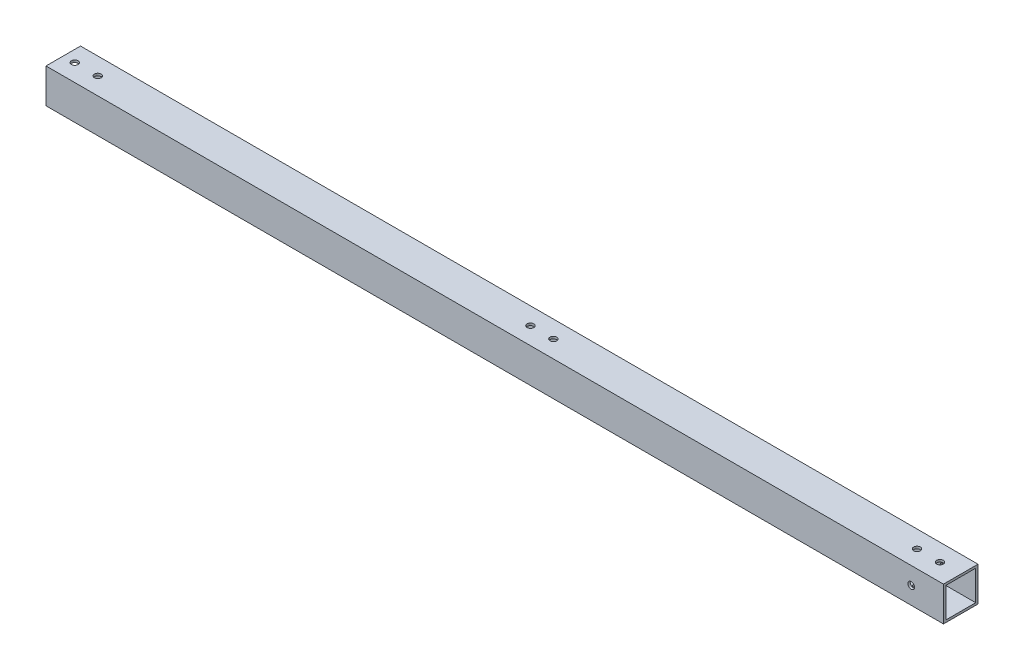
ISO-10303-21;
HEADER;
FILE_DESCRIPTION(('STEP AP214'),'2;1');
FILE_NAME('part.step','',(''),(''),'','','');
FILE_SCHEMA(('AUTOMOTIVE_DESIGN { 1 0 10303 214 1 1 1 1 }'));
ENDSEC;
DATA;
#1=APPLICATION_CONTEXT('core data for automotive mechanical design processes');
#2=APPLICATION_PROTOCOL_DEFINITION('international standard','automotive_design',2000,#1);
#3=PRODUCT_CONTEXT('',#1,'mechanical');
#4=PRODUCT('Part','Part','',(#3));
#5=PRODUCT_RELATED_PRODUCT_CATEGORY('part','',(#4));
#6=PRODUCT_DEFINITION_FORMATION('','',#4);
#7=PRODUCT_DEFINITION_CONTEXT('part definition',#1,'design');
#8=PRODUCT_DEFINITION('design','',#6,#7);
#9=PRODUCT_DEFINITION_SHAPE('','',#8);
#10=(LENGTH_UNIT() NAMED_UNIT(*) SI_UNIT(.MILLI.,.METRE.));
#11=(NAMED_UNIT(*) PLANE_ANGLE_UNIT() SI_UNIT($,.RADIAN.));
#12=(NAMED_UNIT(*) SI_UNIT($,.STERADIAN.) SOLID_ANGLE_UNIT());
#13=UNCERTAINTY_MEASURE_WITH_UNIT(LENGTH_MEASURE(1.E-05),#10,'distance_accuracy_value','');
#14=(GEOMETRIC_REPRESENTATION_CONTEXT(3) GLOBAL_UNCERTAINTY_ASSIGNED_CONTEXT((#13)) GLOBAL_UNIT_ASSIGNED_CONTEXT((#10,
#11,#12)) REPRESENTATION_CONTEXT('',''));
#15=CARTESIAN_POINT('',(0.,0.,0.));
#16=DIRECTION('',(0.,0.,1.));
#17=DIRECTION('',(1.,0.,0.));
#18=AXIS2_PLACEMENT_3D('',#15,#16,#17);
#19=CARTESIAN_POINT('',(390.,0.,0.));
#20=DIRECTION('',(-1.,0.,0.));
#21=DIRECTION('',(0.,0.,1.));
#22=AXIS2_PLACEMENT_3D('',#19,#20,#21);
#23=PLANE('',#22);
#24=DIRECTION('',(0.,1.,0.));
#25=VECTOR('',#24,1.);
#26=CARTESIAN_POINT('',(390.,-7.5,-7.5));
#27=LINE('',#26,#25);
#28=CARTESIAN_POINT('',(390.,-7.5,-7.5));
#29=VERTEX_POINT('',#28);
#30=CARTESIAN_POINT('',(390.,7.5,-7.5));
#31=VERTEX_POINT('',#30);
#32=EDGE_CURVE('E146',#29,#31,#27,.T.);
#33=ORIENTED_EDGE('',*,*,#32,.T.);
#34=DIRECTION('',(0.,0.,1.));
#35=VECTOR('',#34,1.);
#36=CARTESIAN_POINT('',(390.,7.5,7.5));
#37=LINE('',#36,#35);
#38=CARTESIAN_POINT('',(390.,7.5,7.5));
#39=VERTEX_POINT('',#38);
#40=EDGE_CURVE('E149',#31,#39,#37,.T.);
#41=ORIENTED_EDGE('',*,*,#40,.T.);
#42=DIRECTION('',(0.,-1.,0.));
#43=VECTOR('',#42,1.);
#44=CARTESIAN_POINT('',(390.,-7.5,7.5));
#45=LINE('',#44,#43);
#46=CARTESIAN_POINT('',(390.,-7.5,7.5));
#47=VERTEX_POINT('',#46);
#48=EDGE_CURVE('E152',#39,#47,#45,.T.);
#49=ORIENTED_EDGE('',*,*,#48,.T.);
#50=DIRECTION('',(0.,0.,-1.));
#51=VECTOR('',#50,1.);
#52=CARTESIAN_POINT('',(390.,-7.5,7.5));
#53=LINE('',#52,#51);
#54=EDGE_CURVE('E154',#47,#29,#53,.T.);
#55=ORIENTED_EDGE('',*,*,#54,.T.);
#56=EDGE_LOOP('',(#33,#41,#49,#55));
#57=FACE_BOUND('',#56,.T.);
#58=DIRECTION('',(0.,0.,-1.));
#59=VECTOR('',#58,1.);
#60=CARTESIAN_POINT('',(390.,-6.5,6.5));
#61=LINE('',#60,#59);
#62=CARTESIAN_POINT('',(390.,-6.5,6.5));
#63=VERTEX_POINT('',#62);
#64=CARTESIAN_POINT('',(390.,-6.5,-6.5));
#65=VERTEX_POINT('',#64);
#66=EDGE_CURVE('E108',#63,#65,#61,.T.);
#67=ORIENTED_EDGE('',*,*,#66,.F.);
#68=DIRECTION('',(0.,-1.,0.));
#69=VECTOR('',#68,1.);
#70=CARTESIAN_POINT('',(390.,-6.5,6.5));
#71=LINE('',#70,#69);
#72=CARTESIAN_POINT('',(390.,6.5,6.5));
#73=VERTEX_POINT('',#72);
#74=EDGE_CURVE('E130',#73,#63,#71,.T.);
#75=ORIENTED_EDGE('',*,*,#74,.F.);
#76=DIRECTION('',(0.,0.,1.));
#77=VECTOR('',#76,1.);
#78=CARTESIAN_POINT('',(390.,6.5,6.5));
#79=LINE('',#78,#77);
#80=CARTESIAN_POINT('',(390.,6.5,-6.5));
#81=VERTEX_POINT('',#80);
#82=EDGE_CURVE('E128',#81,#73,#79,.T.);
#83=ORIENTED_EDGE('',*,*,#82,.F.);
#84=DIRECTION('',(0.,1.,0.));
#85=VECTOR('',#84,1.);
#86=CARTESIAN_POINT('',(390.,-6.5,-6.5));
#87=LINE('',#86,#85);
#88=EDGE_CURVE('E116',#65,#81,#87,.T.);
#89=ORIENTED_EDGE('',*,*,#88,.F.);
#90=EDGE_LOOP('',(#67,#75,#83,#89));
#91=FACE_BOUND('',#90,.T.);
#92=ADVANCED_FACE('F41',(#57,#91),#23,.F.);
#93=CARTESIAN_POINT('',(0.,0.,0.));
#94=DIRECTION('',(-1.,0.,0.));
#95=DIRECTION('',(0.,0.,1.));
#96=AXIS2_PLACEMENT_3D('',#93,#94,#95);
#97=PLANE('',#96);
#98=DIRECTION('',(0.,1.,0.));
#99=VECTOR('',#98,1.);
#100=CARTESIAN_POINT('',(0.,-7.5,-7.5));
#101=LINE('',#100,#99);
#102=CARTESIAN_POINT('',(0.,-7.5,-7.5));
#103=VERTEX_POINT('',#102);
#104=CARTESIAN_POINT('',(0.,7.5,-7.5));
#105=VERTEX_POINT('',#104);
#106=EDGE_CURVE('E124',#103,#105,#101,.T.);
#107=ORIENTED_EDGE('',*,*,#106,.F.);
#108=DIRECTION('',(0.,0.,-1.));
#109=VECTOR('',#108,1.);
#110=CARTESIAN_POINT('',(0.,-7.5,7.5));
#111=LINE('',#110,#109);
#112=CARTESIAN_POINT('',(0.,-7.5,7.5));
#113=VERTEX_POINT('',#112);
#114=EDGE_CURVE('E150',#113,#103,#111,.T.);
#115=ORIENTED_EDGE('',*,*,#114,.F.);
#116=DIRECTION('',(0.,-1.,0.));
#117=VECTOR('',#116,1.);
#118=CARTESIAN_POINT('',(0.,-7.5,7.5));
#119=LINE('',#118,#117);
#120=CARTESIAN_POINT('',(0.,7.5,7.5));
#121=VERTEX_POINT('',#120);
#122=EDGE_CURVE('E161',#121,#113,#119,.T.);
#123=ORIENTED_EDGE('',*,*,#122,.F.);
#124=DIRECTION('',(0.,0.,1.));
#125=VECTOR('',#124,1.);
#126=CARTESIAN_POINT('',(0.,7.5,7.5));
#127=LINE('',#126,#125);
#128=EDGE_CURVE('E159',#105,#121,#127,.T.);
#129=ORIENTED_EDGE('',*,*,#128,.F.);
#130=EDGE_LOOP('',(#107,#115,#123,#129));
#131=FACE_BOUND('',#130,.T.);
#132=DIRECTION('',(0.,-1.,0.));
#133=VECTOR('',#132,1.);
#134=CARTESIAN_POINT('',(0.,-6.5,6.5));
#135=LINE('',#134,#133);
#136=CARTESIAN_POINT('',(0.,6.5,6.5));
#137=VERTEX_POINT('',#136);
#138=CARTESIAN_POINT('',(0.,-6.5,6.5));
#139=VERTEX_POINT('',#138);
#140=EDGE_CURVE('E117',#137,#139,#135,.T.);
#141=ORIENTED_EDGE('',*,*,#140,.T.);
#142=DIRECTION('',(0.,0.,-1.));
#143=VECTOR('',#142,1.);
#144=CARTESIAN_POINT('',(0.,-6.5,6.5));
#145=LINE('',#144,#143);
#146=CARTESIAN_POINT('',(0.,-6.5,-6.5));
#147=VERTEX_POINT('',#146);
#148=EDGE_CURVE('E66',#139,#147,#145,.T.);
#149=ORIENTED_EDGE('',*,*,#148,.T.);
#150=DIRECTION('',(0.,1.,0.));
#151=VECTOR('',#150,1.);
#152=CARTESIAN_POINT('',(0.,-6.5,-6.5));
#153=LINE('',#152,#151);
#154=CARTESIAN_POINT('',(0.,6.5,-6.5));
#155=VERTEX_POINT('',#154);
#156=EDGE_CURVE('E123',#147,#155,#153,.T.);
#157=ORIENTED_EDGE('',*,*,#156,.T.);
#158=DIRECTION('',(0.,0.,1.));
#159=VECTOR('',#158,1.);
#160=CARTESIAN_POINT('',(0.,6.5,6.5));
#161=LINE('',#160,#159);
#162=EDGE_CURVE('E138',#155,#137,#161,.T.);
#163=ORIENTED_EDGE('',*,*,#162,.T.);
#164=EDGE_LOOP('',(#141,#149,#157,#163));
#165=FACE_BOUND('',#164,.T.);
#166=ADVANCED_FACE('F267',(#131,#165),#97,.T.);
#167=CARTESIAN_POINT('',(390.,-7.5,-7.5));
#168=DIRECTION('',(0.,0.,1.));
#169=DIRECTION('',(1.,0.,0.));
#170=AXIS2_PLACEMENT_3D('',#167,#168,#169);
#171=PLANE('',#170);
#172=CARTESIAN_POINT('',(376.,1.99059518868339E-12,-7.5));
#173=DIRECTION('',(0.,0.,-1.));
#174=DIRECTION('',(-1.,0.,0.));
#175=AXIS2_PLACEMENT_3D('',#172,#173,#174);
#176=CIRCLE('',#175,1.44999999999945);
#177=CARTESIAN_POINT('',(374.550000000001,1.99059518868339E-12,-7.5));
#178=VERTEX_POINT('',#177);
#179=EDGE_CURVE('E247',#178,#178,#176,.T.);
#180=ORIENTED_EDGE('',*,*,#179,.F.);
#181=EDGE_LOOP('',(#180));
#182=FACE_BOUND('',#181,.T.);
#183=ORIENTED_EDGE('',*,*,#106,.T.);
#184=DIRECTION('',(-1.,0.,0.));
#185=VECTOR('',#184,1.);
#186=CARTESIAN_POINT('',(390.,7.5,-7.5));
#187=LINE('',#186,#185);
#188=EDGE_CURVE('E11',#31,#105,#187,.T.);
#189=ORIENTED_EDGE('',*,*,#188,.F.);
#190=ORIENTED_EDGE('',*,*,#32,.F.);
#191=DIRECTION('',(-1.,0.,0.));
#192=VECTOR('',#191,1.);
#193=CARTESIAN_POINT('',(390.,-7.5,-7.5));
#194=LINE('',#193,#192);
#195=EDGE_CURVE('E156',#29,#103,#194,.T.);
#196=ORIENTED_EDGE('',*,*,#195,.T.);
#197=EDGE_LOOP('',(#183,#189,#190,#196));
#198=FACE_BOUND('',#197,.T.);
#199=ADVANCED_FACE('F43',(#182,#198),#171,.F.);
#200=CARTESIAN_POINT('',(390.,7.5,7.5));
#201=DIRECTION('',(0.,-1.,0.));
#202=DIRECTION('',(0.,0.,-1.));
#203=AXIS2_PLACEMENT_3D('',#200,#201,#202);
#204=PLANE('',#203);
#205=CARTESIAN_POINT('',(381.,7.5,0.));
#206=DIRECTION('',(0.,1.,0.));
#207=DIRECTION('',(0.,0.,1.));
#208=AXIS2_PLACEMENT_3D('',#205,#206,#207);
#209=CIRCLE('',#208,1.45);
#210=CARTESIAN_POINT('',(381.,7.5,1.44999999999993));
#211=VERTEX_POINT('',#210);
#212=EDGE_CURVE('E230',#211,#211,#209,.T.);
#213=ORIENTED_EDGE('',*,*,#212,.F.);
#214=EDGE_LOOP('',(#213));
#215=FACE_BOUND('',#214,.T.);
#216=CARTESIAN_POINT('',(5.,7.5,0.));
#217=DIRECTION('',(0.,1.,0.));
#218=DIRECTION('',(0.,0.,1.));
#219=AXIS2_PLACEMENT_3D('',#216,#217,#218);
#220=CIRCLE('',#219,1.45);
#221=CARTESIAN_POINT('',(5.,7.5,1.44999999999997));
#222=VERTEX_POINT('',#221);
#223=EDGE_CURVE('E219',#222,#222,#220,.T.);
#224=ORIENTED_EDGE('',*,*,#223,.F.);
#225=EDGE_LOOP('',(#224));
#226=FACE_BOUND('',#225,.T.);
#227=CARTESIAN_POINT('',(15.,7.5,0.));
#228=DIRECTION('',(0.,1.,0.));
#229=DIRECTION('',(0.,0.,1.));
#230=AXIS2_PLACEMENT_3D('',#227,#228,#229);
#231=CIRCLE('',#230,1.45);
#232=CARTESIAN_POINT('',(15.,7.5,1.44999999999997));
#233=VERTEX_POINT('',#232);
#234=EDGE_CURVE('E218',#233,#233,#231,.T.);
#235=ORIENTED_EDGE('',*,*,#234,.F.);
#236=EDGE_LOOP('',(#235));
#237=FACE_BOUND('',#236,.T.);
#238=CARTESIAN_POINT('',(213.,7.5,0.));
#239=DIRECTION('',(0.,1.,0.));
#240=DIRECTION('',(0.,0.,1.));
#241=AXIS2_PLACEMENT_3D('',#238,#239,#240);
#242=CIRCLE('',#241,1.45);
#243=CARTESIAN_POINT('',(213.,7.5,1.45));
#244=VERTEX_POINT('',#243);
#245=EDGE_CURVE('E212',#244,#244,#242,.T.);
#246=ORIENTED_EDGE('',*,*,#245,.F.);
#247=EDGE_LOOP('',(#246));
#248=FACE_BOUND('',#247,.T.);
#249=CARTESIAN_POINT('',(371.,7.5,0.));
#250=DIRECTION('',(0.,1.,0.));
#251=DIRECTION('',(0.,0.,1.));
#252=AXIS2_PLACEMENT_3D('',#249,#250,#251);
#253=CIRCLE('',#252,1.45);
#254=CARTESIAN_POINT('',(371.,7.5,1.44999999999993));
#255=VERTEX_POINT('',#254);
#256=EDGE_CURVE('E231',#255,#255,#253,.T.);
#257=ORIENTED_EDGE('',*,*,#256,.F.);
#258=EDGE_LOOP('',(#257));
#259=FACE_BOUND('',#258,.T.);
#260=CARTESIAN_POINT('',(203.,7.5,0.));
#261=DIRECTION('',(0.,1.,0.));
#262=DIRECTION('',(0.,0.,1.));
#263=AXIS2_PLACEMENT_3D('',#260,#261,#262);
#264=CIRCLE('',#263,1.45);
#265=CARTESIAN_POINT('',(203.,7.5,1.45));
#266=VERTEX_POINT('',#265);
#267=EDGE_CURVE('E209',#266,#266,#264,.T.);
#268=ORIENTED_EDGE('',*,*,#267,.F.);
#269=EDGE_LOOP('',(#268));
#270=FACE_BOUND('',#269,.T.);
#271=ORIENTED_EDGE('',*,*,#128,.T.);
#272=DIRECTION('',(-1.,0.,0.));
#273=VECTOR('',#272,1.);
#274=CARTESIAN_POINT('',(390.,7.5,7.5));
#275=LINE('',#274,#273);
#276=EDGE_CURVE('E50',#39,#121,#275,.T.);
#277=ORIENTED_EDGE('',*,*,#276,.F.);
#278=ORIENTED_EDGE('',*,*,#40,.F.);
#279=ORIENTED_EDGE('',*,*,#188,.T.);
#280=EDGE_LOOP('',(#271,#277,#278,#279));
#281=FACE_BOUND('',#280,.T.);
#282=ADVANCED_FACE('F296',(#215,#226,#237,#248,#259,#270,#281),#204,.F.);
#283=CARTESIAN_POINT('',(390.,-7.5,7.5));
#284=DIRECTION('',(0.,0.,-1.));
#285=DIRECTION('',(-1.,0.,0.));
#286=AXIS2_PLACEMENT_3D('',#283,#284,#285);
#287=PLANE('',#286);
#288=CARTESIAN_POINT('',(376.,1.99059518868339E-12,7.5));
#289=DIRECTION('',(0.,0.,-1.));
#290=DIRECTION('',(-1.,0.,0.));
#291=AXIS2_PLACEMENT_3D('',#288,#289,#290);
#292=CIRCLE('',#291,1.44999999999945);
#293=CARTESIAN_POINT('',(374.550000000001,1.99059518868339E-12,7.5));
#294=VERTEX_POINT('',#293);
#295=EDGE_CURVE('E250',#294,#294,#292,.T.);
#296=ORIENTED_EDGE('',*,*,#295,.T.);
#297=EDGE_LOOP('',(#296));
#298=FACE_BOUND('',#297,.T.);
#299=ORIENTED_EDGE('',*,*,#122,.T.);
#300=DIRECTION('',(-1.,0.,0.));
#301=VECTOR('',#300,1.);
#302=CARTESIAN_POINT('',(390.,-7.5,7.5));
#303=LINE('',#302,#301);
#304=EDGE_CURVE('E166',#47,#113,#303,.T.);
#305=ORIENTED_EDGE('',*,*,#304,.F.);
#306=ORIENTED_EDGE('',*,*,#48,.F.);
#307=ORIENTED_EDGE('',*,*,#276,.T.);
#308=EDGE_LOOP('',(#299,#305,#306,#307));
#309=FACE_BOUND('',#308,.T.);
#310=ADVANCED_FACE('F293',(#298,#309),#287,.F.);
#311=CARTESIAN_POINT('',(390.,-7.5,7.5));
#312=DIRECTION('',(0.,1.,0.));
#313=DIRECTION('',(0.,0.,1.));
#314=AXIS2_PLACEMENT_3D('',#311,#312,#313);
#315=PLANE('',#314);
#316=CARTESIAN_POINT('',(381.,-7.5,0.));
#317=DIRECTION('',(0.,1.,0.));
#318=DIRECTION('',(0.,0.,1.));
#319=AXIS2_PLACEMENT_3D('',#316,#317,#318);
#320=CIRCLE('',#319,1.45);
#321=CARTESIAN_POINT('',(381.,-7.5,1.44999999999993));
#322=VERTEX_POINT('',#321);
#323=EDGE_CURVE('E227',#322,#322,#320,.T.);
#324=ORIENTED_EDGE('',*,*,#323,.T.);
#325=EDGE_LOOP('',(#324));
#326=FACE_BOUND('',#325,.T.);
#327=CARTESIAN_POINT('',(5.,-7.5,0.));
#328=DIRECTION('',(0.,1.,0.));
#329=DIRECTION('',(0.,0.,1.));
#330=AXIS2_PLACEMENT_3D('',#327,#328,#329);
#331=CIRCLE('',#330,1.45);
#332=CARTESIAN_POINT('',(5.,-7.5,1.44999999999997));
#333=VERTEX_POINT('',#332);
#334=EDGE_CURVE('E234',#333,#333,#331,.T.);
#335=ORIENTED_EDGE('',*,*,#334,.T.);
#336=EDGE_LOOP('',(#335));
#337=FACE_BOUND('',#336,.T.);
#338=CARTESIAN_POINT('',(15.,-7.5,0.));
#339=DIRECTION('',(0.,1.,0.));
#340=DIRECTION('',(0.,0.,1.));
#341=AXIS2_PLACEMENT_3D('',#338,#339,#340);
#342=CIRCLE('',#341,1.45);
#343=CARTESIAN_POINT('',(15.,-7.5,1.44999999999997));
#344=VERTEX_POINT('',#343);
#345=EDGE_CURVE('E215',#344,#344,#342,.T.);
#346=ORIENTED_EDGE('',*,*,#345,.T.);
#347=EDGE_LOOP('',(#346));
#348=FACE_BOUND('',#347,.T.);
#349=CARTESIAN_POINT('',(213.,-7.5,0.));
#350=DIRECTION('',(0.,1.,0.));
#351=DIRECTION('',(0.,0.,1.));
#352=AXIS2_PLACEMENT_3D('',#349,#350,#351);
#353=CIRCLE('',#352,1.45);
#354=CARTESIAN_POINT('',(213.,-7.5,1.45));
#355=VERTEX_POINT('',#354);
#356=EDGE_CURVE('E222',#355,#355,#353,.T.);
#357=ORIENTED_EDGE('',*,*,#356,.T.);
#358=EDGE_LOOP('',(#357));
#359=FACE_BOUND('',#358,.T.);
#360=CARTESIAN_POINT('',(371.,-7.5,0.));
#361=DIRECTION('',(0.,1.,0.));
#362=DIRECTION('',(0.,0.,1.));
#363=AXIS2_PLACEMENT_3D('',#360,#361,#362);
#364=CIRCLE('',#363,1.45);
#365=CARTESIAN_POINT('',(371.,-7.5,1.44999999999993));
#366=VERTEX_POINT('',#365);
#367=EDGE_CURVE('E239',#366,#366,#364,.T.);
#368=ORIENTED_EDGE('',*,*,#367,.T.);
#369=EDGE_LOOP('',(#368));
#370=FACE_BOUND('',#369,.T.);
#371=CARTESIAN_POINT('',(203.,-7.5,0.));
#372=DIRECTION('',(0.,1.,0.));
#373=DIRECTION('',(0.,0.,1.));
#374=AXIS2_PLACEMENT_3D('',#371,#372,#373);
#375=CIRCLE('',#374,1.45);
#376=CARTESIAN_POINT('',(203.,-7.5,1.45));
#377=VERTEX_POINT('',#376);
#378=EDGE_CURVE('E175',#377,#377,#375,.T.);
#379=ORIENTED_EDGE('',*,*,#378,.T.);
#380=EDGE_LOOP('',(#379));
#381=FACE_BOUND('',#380,.T.);
#382=ORIENTED_EDGE('',*,*,#114,.T.);
#383=ORIENTED_EDGE('',*,*,#195,.F.);
#384=ORIENTED_EDGE('',*,*,#54,.F.);
#385=ORIENTED_EDGE('',*,*,#304,.T.);
#386=EDGE_LOOP('',(#382,#383,#384,#385));
#387=FACE_BOUND('',#386,.T.);
#388=ADVANCED_FACE('F290',(#326,#337,#348,#359,#370,#381,#387),#315,.F.);
#389=CARTESIAN_POINT('',(390.,-6.5,6.5));
#390=DIRECTION('',(0.,1.,0.));
#391=DIRECTION('',(0.,0.,1.));
#392=AXIS2_PLACEMENT_3D('',#389,#390,#391);
#393=PLANE('',#392);
#394=CARTESIAN_POINT('',(381.,-6.5,0.));
#395=DIRECTION('',(0.,1.,0.));
#396=DIRECTION('',(0.,0.,1.));
#397=AXIS2_PLACEMENT_3D('',#394,#395,#396);
#398=CIRCLE('',#397,1.45);
#399=CARTESIAN_POINT('',(381.,-6.5,1.44999999999993));
#400=VERTEX_POINT('',#399);
#401=EDGE_CURVE('E136',#400,#400,#398,.T.);
#402=ORIENTED_EDGE('',*,*,#401,.F.);
#403=EDGE_LOOP('',(#402));
#404=FACE_BOUND('',#403,.T.);
#405=CARTESIAN_POINT('',(5.,-6.5,0.));
#406=DIRECTION('',(0.,1.,0.));
#407=DIRECTION('',(0.,0.,1.));
#408=AXIS2_PLACEMENT_3D('',#405,#406,#407);
#409=CIRCLE('',#408,1.45);
#410=CARTESIAN_POINT('',(5.,-6.5,1.44999999999997));
#411=VERTEX_POINT('',#410);
#412=EDGE_CURVE('E190',#411,#411,#409,.T.);
#413=ORIENTED_EDGE('',*,*,#412,.F.);
#414=EDGE_LOOP('',(#413));
#415=FACE_BOUND('',#414,.T.);
#416=CARTESIAN_POINT('',(15.,-6.5,0.));
#417=DIRECTION('',(0.,1.,0.));
#418=DIRECTION('',(0.,0.,1.));
#419=AXIS2_PLACEMENT_3D('',#416,#417,#418);
#420=CIRCLE('',#419,1.45);
#421=CARTESIAN_POINT('',(15.,-6.5,1.44999999999997));
#422=VERTEX_POINT('',#421);
#423=EDGE_CURVE('E187',#422,#422,#420,.T.);
#424=ORIENTED_EDGE('',*,*,#423,.F.);
#425=EDGE_LOOP('',(#424));
#426=FACE_BOUND('',#425,.T.);
#427=CARTESIAN_POINT('',(213.,-6.5,0.));
#428=DIRECTION('',(0.,1.,0.));
#429=DIRECTION('',(0.,0.,1.));
#430=AXIS2_PLACEMENT_3D('',#427,#428,#429);
#431=CIRCLE('',#430,1.45);
#432=CARTESIAN_POINT('',(213.,-6.5,1.45));
#433=VERTEX_POINT('',#432);
#434=EDGE_CURVE('E183',#433,#433,#431,.T.);
#435=ORIENTED_EDGE('',*,*,#434,.F.);
#436=EDGE_LOOP('',(#435));
#437=FACE_BOUND('',#436,.T.);
#438=CARTESIAN_POINT('',(371.,-6.5,0.));
#439=DIRECTION('',(0.,1.,0.));
#440=DIRECTION('',(0.,0.,1.));
#441=AXIS2_PLACEMENT_3D('',#438,#439,#440);
#442=CIRCLE('',#441,1.45);
#443=CARTESIAN_POINT('',(371.,-6.5,1.44999999999993));
#444=VERTEX_POINT('',#443);
#445=EDGE_CURVE('E179',#444,#444,#442,.T.);
#446=ORIENTED_EDGE('',*,*,#445,.F.);
#447=EDGE_LOOP('',(#446));
#448=FACE_BOUND('',#447,.T.);
#449=CARTESIAN_POINT('',(203.,-6.5,0.));
#450=DIRECTION('',(0.,1.,0.));
#451=DIRECTION('',(0.,0.,1.));
#452=AXIS2_PLACEMENT_3D('',#449,#450,#451);
#453=CIRCLE('',#452,1.45);
#454=CARTESIAN_POINT('',(203.,-6.5,1.45));
#455=VERTEX_POINT('',#454);
#456=EDGE_CURVE('E174',#455,#455,#453,.T.);
#457=ORIENTED_EDGE('',*,*,#456,.F.);
#458=EDGE_LOOP('',(#457));
#459=FACE_BOUND('',#458,.T.);
#460=ORIENTED_EDGE('',*,*,#148,.F.);
#461=DIRECTION('',(-1.,0.,0.));
#462=VECTOR('',#461,1.);
#463=CARTESIAN_POINT('',(390.,-6.5,6.5));
#464=LINE('',#463,#462);
#465=EDGE_CURVE('E112',#63,#139,#464,.T.);
#466=ORIENTED_EDGE('',*,*,#465,.F.);
#467=ORIENTED_EDGE('',*,*,#66,.T.);
#468=DIRECTION('',(-1.,0.,0.));
#469=VECTOR('',#468,1.);
#470=CARTESIAN_POINT('',(390.,-6.5,-6.5));
#471=LINE('',#470,#469);
#472=EDGE_CURVE('E111',#65,#147,#471,.T.);
#473=ORIENTED_EDGE('',*,*,#472,.T.);
#474=EDGE_LOOP('',(#460,#466,#467,#473));
#475=FACE_BOUND('',#474,.T.);
#476=ADVANCED_FACE('F110',(#404,#415,#426,#437,#448,#459,#475),#393,.T.);
#477=CARTESIAN_POINT('',(390.,-6.5,-6.5));
#478=DIRECTION('',(0.,0.,1.));
#479=DIRECTION('',(0.,-1.,0.));
#480=AXIS2_PLACEMENT_3D('',#477,#478,#479);
#481=PLANE('',#480);
#482=CARTESIAN_POINT('',(376.,1.99059518868339E-12,-6.5));
#483=DIRECTION('',(0.,0.,1.));
#484=DIRECTION('',(0.,-1.,0.));
#485=AXIS2_PLACEMENT_3D('',#482,#483,#484);
#486=CIRCLE('',#485,1.44999999999945);
#487=CARTESIAN_POINT('',(376.,-1.44999999999746,-6.5));
#488=VERTEX_POINT('',#487);
#489=EDGE_CURVE('E242',#488,#488,#486,.T.);
#490=ORIENTED_EDGE('',*,*,#489,.F.);
#491=EDGE_LOOP('',(#490));
#492=FACE_BOUND('',#491,.T.);
#493=ORIENTED_EDGE('',*,*,#156,.F.);
#494=ORIENTED_EDGE('',*,*,#472,.F.);
#495=ORIENTED_EDGE('',*,*,#88,.T.);
#496=DIRECTION('',(-1.,0.,0.));
#497=VECTOR('',#496,1.);
#498=CARTESIAN_POINT('',(390.,6.5,-6.5));
#499=LINE('',#498,#497);
#500=EDGE_CURVE('E125',#81,#155,#499,.T.);
#501=ORIENTED_EDGE('',*,*,#500,.T.);
#502=EDGE_LOOP('',(#493,#494,#495,#501));
#503=FACE_BOUND('',#502,.T.);
#504=ADVANCED_FACE('F120',(#492,#503),#481,.T.);
#505=CARTESIAN_POINT('',(390.,6.5,6.5));
#506=DIRECTION('',(0.,-1.,0.));
#507=DIRECTION('',(0.,0.,-1.));
#508=AXIS2_PLACEMENT_3D('',#505,#506,#507);
#509=PLANE('',#508);
#510=CARTESIAN_POINT('',(381.,6.5,0.));
#511=DIRECTION('',(0.,-1.,0.));
#512=DIRECTION('',(0.,0.,-1.));
#513=AXIS2_PLACEMENT_3D('',#510,#511,#512);
#514=CIRCLE('',#513,1.45);
#515=CARTESIAN_POINT('',(381.,6.5,-1.45000000000007));
#516=VERTEX_POINT('',#515);
#517=EDGE_CURVE('E191',#516,#516,#514,.T.);
#518=ORIENTED_EDGE('',*,*,#517,.F.);
#519=EDGE_LOOP('',(#518));
#520=FACE_BOUND('',#519,.T.);
#521=CARTESIAN_POINT('',(5.,6.5,0.));
#522=DIRECTION('',(0.,-1.,0.));
#523=DIRECTION('',(0.,0.,-1.));
#524=AXIS2_PLACEMENT_3D('',#521,#522,#523);
#525=CIRCLE('',#524,1.45);
#526=CARTESIAN_POINT('',(5.,6.5,-1.45000000000003));
#527=VERTEX_POINT('',#526);
#528=EDGE_CURVE('E188',#527,#527,#525,.T.);
#529=ORIENTED_EDGE('',*,*,#528,.F.);
#530=EDGE_LOOP('',(#529));
#531=FACE_BOUND('',#530,.T.);
#532=CARTESIAN_POINT('',(15.,6.5,0.));
#533=DIRECTION('',(0.,-1.,0.));
#534=DIRECTION('',(0.,0.,-1.));
#535=AXIS2_PLACEMENT_3D('',#532,#533,#534);
#536=CIRCLE('',#535,1.45);
#537=CARTESIAN_POINT('',(15.,6.5,-1.45000000000003));
#538=VERTEX_POINT('',#537);
#539=EDGE_CURVE('E184',#538,#538,#536,.T.);
#540=ORIENTED_EDGE('',*,*,#539,.F.);
#541=EDGE_LOOP('',(#540));
#542=FACE_BOUND('',#541,.T.);
#543=CARTESIAN_POINT('',(213.,6.5,0.));
#544=DIRECTION('',(0.,-1.,0.));
#545=DIRECTION('',(0.,0.,-1.));
#546=AXIS2_PLACEMENT_3D('',#543,#544,#545);
#547=CIRCLE('',#546,1.45);
#548=CARTESIAN_POINT('',(213.,6.5,-1.45));
#549=VERTEX_POINT('',#548);
#550=EDGE_CURVE('E180',#549,#549,#547,.T.);
#551=ORIENTED_EDGE('',*,*,#550,.F.);
#552=EDGE_LOOP('',(#551));
#553=FACE_BOUND('',#552,.T.);
#554=CARTESIAN_POINT('',(371.,6.5,0.));
#555=DIRECTION('',(0.,-1.,0.));
#556=DIRECTION('',(0.,0.,-1.));
#557=AXIS2_PLACEMENT_3D('',#554,#555,#556);
#558=CIRCLE('',#557,1.45);
#559=CARTESIAN_POINT('',(371.,6.5,-1.45000000000007));
#560=VERTEX_POINT('',#559);
#561=EDGE_CURVE('E176',#560,#560,#558,.T.);
#562=ORIENTED_EDGE('',*,*,#561,.F.);
#563=EDGE_LOOP('',(#562));
#564=FACE_BOUND('',#563,.T.);
#565=CARTESIAN_POINT('',(203.,6.5,0.));
#566=DIRECTION('',(0.,-1.,0.));
#567=DIRECTION('',(0.,0.,-1.));
#568=AXIS2_PLACEMENT_3D('',#565,#566,#567);
#569=CIRCLE('',#568,1.45);
#570=CARTESIAN_POINT('',(203.,6.5,-1.45));
#571=VERTEX_POINT('',#570);
#572=EDGE_CURVE('E171',#571,#571,#569,.T.);
#573=ORIENTED_EDGE('',*,*,#572,.F.);
#574=EDGE_LOOP('',(#573));
#575=FACE_BOUND('',#574,.T.);
#576=ORIENTED_EDGE('',*,*,#162,.F.);
#577=ORIENTED_EDGE('',*,*,#500,.F.);
#578=ORIENTED_EDGE('',*,*,#82,.T.);
#579=DIRECTION('',(-1.,0.,0.));
#580=VECTOR('',#579,1.);
#581=CARTESIAN_POINT('',(390.,6.5,6.5));
#582=LINE('',#581,#580);
#583=EDGE_CURVE('E58',#73,#137,#582,.T.);
#584=ORIENTED_EDGE('',*,*,#583,.T.);
#585=EDGE_LOOP('',(#576,#577,#578,#584));
#586=FACE_BOUND('',#585,.T.);
#587=ADVANCED_FACE('F263',(#520,#531,#542,#553,#564,#575,#586),#509,.T.);
#588=CARTESIAN_POINT('',(390.,-6.5,6.5));
#589=DIRECTION('',(0.,0.,-1.));
#590=DIRECTION('',(-1.,0.,0.));
#591=AXIS2_PLACEMENT_3D('',#588,#589,#590);
#592=PLANE('',#591);
#593=CARTESIAN_POINT('',(376.,1.99059518868339E-12,6.5));
#594=DIRECTION('',(0.,0.,-1.));
#595=DIRECTION('',(-1.,0.,0.));
#596=AXIS2_PLACEMENT_3D('',#593,#594,#595);
#597=CIRCLE('',#596,1.44999999999945);
#598=CARTESIAN_POINT('',(374.550000000001,1.99059518868339E-12,6.5));
#599=VERTEX_POINT('',#598);
#600=EDGE_CURVE('E45',#599,#599,#597,.T.);
#601=ORIENTED_EDGE('',*,*,#600,.F.);
#602=EDGE_LOOP('',(#601));
#603=FACE_BOUND('',#602,.T.);
#604=ORIENTED_EDGE('',*,*,#140,.F.);
#605=ORIENTED_EDGE('',*,*,#583,.F.);
#606=ORIENTED_EDGE('',*,*,#74,.T.);
#607=ORIENTED_EDGE('',*,*,#465,.T.);
#608=EDGE_LOOP('',(#604,#605,#606,#607));
#609=FACE_BOUND('',#608,.T.);
#610=ADVANCED_FACE('F260',(#603,#609),#592,.T.);
#611=CARTESIAN_POINT('',(203.,-7.5,0.));
#612=DIRECTION('',(0.,1.,0.));
#613=DIRECTION('',(0.,0.,1.));
#614=AXIS2_PLACEMENT_3D('',#611,#612,#613);
#615=CYLINDRICAL_SURFACE('',#614,1.45);
#616=ORIENTED_EDGE('',*,*,#572,.T.);
#617=EDGE_LOOP('',(#616));
#618=FACE_BOUND('',#617,.T.);
#619=ORIENTED_EDGE('',*,*,#267,.T.);
#620=EDGE_LOOP('',(#619));
#621=FACE_BOUND('',#620,.T.);
#622=ADVANCED_FACE('F262',(#618,#621),#615,.F.);
#623=CARTESIAN_POINT('',(371.,-7.5,0.));
#624=DIRECTION('',(0.,1.,0.));
#625=DIRECTION('',(0.,0.,1.));
#626=AXIS2_PLACEMENT_3D('',#623,#624,#625);
#627=CYLINDRICAL_SURFACE('',#626,1.45);
#628=ORIENTED_EDGE('',*,*,#561,.T.);
#629=EDGE_LOOP('',(#628));
#630=FACE_BOUND('',#629,.T.);
#631=ORIENTED_EDGE('',*,*,#256,.T.);
#632=EDGE_LOOP('',(#631));
#633=FACE_BOUND('',#632,.T.);
#634=ADVANCED_FACE('F329',(#630,#633),#627,.F.);
#635=CARTESIAN_POINT('',(213.,-7.5,0.));
#636=DIRECTION('',(0.,1.,0.));
#637=DIRECTION('',(0.,0.,1.));
#638=AXIS2_PLACEMENT_3D('',#635,#636,#637);
#639=CYLINDRICAL_SURFACE('',#638,1.45);
#640=ORIENTED_EDGE('',*,*,#550,.T.);
#641=EDGE_LOOP('',(#640));
#642=FACE_BOUND('',#641,.T.);
#643=ORIENTED_EDGE('',*,*,#245,.T.);
#644=EDGE_LOOP('',(#643));
#645=FACE_BOUND('',#644,.T.);
#646=ADVANCED_FACE('F336',(#642,#645),#639,.F.);
#647=CARTESIAN_POINT('',(15.,-7.5,0.));
#648=DIRECTION('',(0.,1.,0.));
#649=DIRECTION('',(0.,0.,1.));
#650=AXIS2_PLACEMENT_3D('',#647,#648,#649);
#651=CYLINDRICAL_SURFACE('',#650,1.45);
#652=ORIENTED_EDGE('',*,*,#539,.T.);
#653=EDGE_LOOP('',(#652));
#654=FACE_BOUND('',#653,.T.);
#655=ORIENTED_EDGE('',*,*,#234,.T.);
#656=EDGE_LOOP('',(#655));
#657=FACE_BOUND('',#656,.T.);
#658=ADVANCED_FACE('F384',(#654,#657),#651,.F.);
#659=CARTESIAN_POINT('',(5.,-7.5,0.));
#660=DIRECTION('',(0.,1.,0.));
#661=DIRECTION('',(0.,0.,1.));
#662=AXIS2_PLACEMENT_3D('',#659,#660,#661);
#663=CYLINDRICAL_SURFACE('',#662,1.45);
#664=ORIENTED_EDGE('',*,*,#528,.T.);
#665=EDGE_LOOP('',(#664));
#666=FACE_BOUND('',#665,.T.);
#667=ORIENTED_EDGE('',*,*,#223,.T.);
#668=EDGE_LOOP('',(#667));
#669=FACE_BOUND('',#668,.T.);
#670=ADVANCED_FACE('F350',(#666,#669),#663,.F.);
#671=CARTESIAN_POINT('',(381.,-7.5,0.));
#672=DIRECTION('',(0.,1.,0.));
#673=DIRECTION('',(0.,0.,1.));
#674=AXIS2_PLACEMENT_3D('',#671,#672,#673);
#675=CYLINDRICAL_SURFACE('',#674,1.45);
#676=ORIENTED_EDGE('',*,*,#517,.T.);
#677=EDGE_LOOP('',(#676));
#678=FACE_BOUND('',#677,.T.);
#679=ORIENTED_EDGE('',*,*,#212,.T.);
#680=EDGE_LOOP('',(#679));
#681=FACE_BOUND('',#680,.T.);
#682=ADVANCED_FACE('F342',(#678,#681),#675,.F.);
#683=ORIENTED_EDGE('',*,*,#456,.T.);
#684=EDGE_LOOP('',(#683));
#685=FACE_BOUND('',#684,.T.);
#686=ORIENTED_EDGE('',*,*,#378,.F.);
#687=EDGE_LOOP('',(#686));
#688=FACE_BOUND('',#687,.T.);
#689=ADVANCED_FACE('F332',(#685,#688),#615,.F.);
#690=ORIENTED_EDGE('',*,*,#445,.T.);
#691=EDGE_LOOP('',(#690));
#692=FACE_BOUND('',#691,.T.);
#693=ORIENTED_EDGE('',*,*,#367,.F.);
#694=EDGE_LOOP('',(#693));
#695=FACE_BOUND('',#694,.T.);
#696=ADVANCED_FACE('F339',(#692,#695),#627,.F.);
#697=ORIENTED_EDGE('',*,*,#434,.T.);
#698=EDGE_LOOP('',(#697));
#699=FACE_BOUND('',#698,.T.);
#700=ORIENTED_EDGE('',*,*,#356,.F.);
#701=EDGE_LOOP('',(#700));
#702=FACE_BOUND('',#701,.T.);
#703=ADVANCED_FACE('F348',(#699,#702),#639,.F.);
#704=ORIENTED_EDGE('',*,*,#423,.T.);
#705=EDGE_LOOP('',(#704));
#706=FACE_BOUND('',#705,.T.);
#707=ORIENTED_EDGE('',*,*,#345,.F.);
#708=EDGE_LOOP('',(#707));
#709=FACE_BOUND('',#708,.T.);
#710=ADVANCED_FACE('F375',(#706,#709),#651,.F.);
#711=ORIENTED_EDGE('',*,*,#412,.T.);
#712=EDGE_LOOP('',(#711));
#713=FACE_BOUND('',#712,.T.);
#714=ORIENTED_EDGE('',*,*,#334,.F.);
#715=EDGE_LOOP('',(#714));
#716=FACE_BOUND('',#715,.T.);
#717=ADVANCED_FACE('F382',(#713,#716),#663,.F.);
#718=ORIENTED_EDGE('',*,*,#401,.T.);
#719=EDGE_LOOP('',(#718));
#720=FACE_BOUND('',#719,.T.);
#721=ORIENTED_EDGE('',*,*,#323,.F.);
#722=EDGE_LOOP('',(#721));
#723=FACE_BOUND('',#722,.T.);
#724=ADVANCED_FACE('F352',(#720,#723),#675,.F.);
#725=CARTESIAN_POINT('',(376.,1.99059518868339E-12,7.5));
#726=DIRECTION('',(0.,0.,-1.));
#727=DIRECTION('',(-1.,0.,0.));
#728=AXIS2_PLACEMENT_3D('',#725,#726,#727);
#729=CYLINDRICAL_SURFACE('',#728,1.44999999999945);
#730=ORIENTED_EDGE('',*,*,#600,.T.);
#731=EDGE_LOOP('',(#730));
#732=FACE_BOUND('',#731,.T.);
#733=ORIENTED_EDGE('',*,*,#295,.F.);
#734=EDGE_LOOP('',(#733));
#735=FACE_BOUND('',#734,.T.);
#736=ADVANCED_FACE('F257',(#732,#735),#729,.F.);
#737=ORIENTED_EDGE('',*,*,#489,.T.);
#738=EDGE_LOOP('',(#737));
#739=FACE_BOUND('',#738,.T.);
#740=ORIENTED_EDGE('',*,*,#179,.T.);
#741=EDGE_LOOP('',(#740));
#742=FACE_BOUND('',#741,.T.);
#743=ADVANCED_FACE('F424',(#739,#742),#729,.F.);
#744=CLOSED_SHELL('',(#92,#166,#199,#282,#310,#388,#476,#504,#587,#610,#622,#634,#646,#658,#670,
#682,#689,#696,#703,#710,#717,#724,#736,#743));
#745=MANIFOLD_SOLID_BREP('B2',#744);
#746=ADVANCED_BREP_SHAPE_REPRESENTATION('',(#18,#745),#14);
#747=SHAPE_DEFINITION_REPRESENTATION(#9,#746);
ENDSEC;
END-ISO-10303-21;
